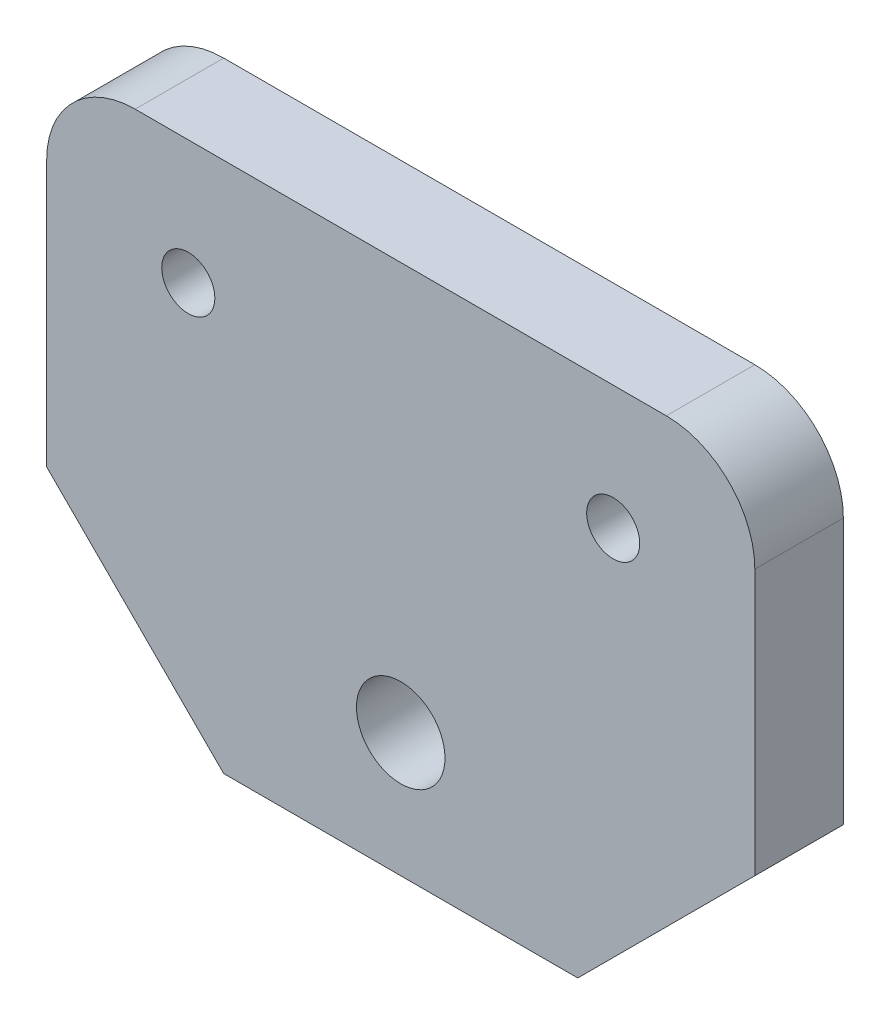
ISO-10303-21;
HEADER;
FILE_DESCRIPTION(('STEP AP214'),'2;1');
FILE_NAME('part.step','',(''),(''),'','','');
FILE_SCHEMA(('AUTOMOTIVE_DESIGN { 1 0 10303 214 1 1 1 1 }'));
ENDSEC;
DATA;
#1=APPLICATION_CONTEXT('core data for automotive mechanical design processes');
#2=APPLICATION_PROTOCOL_DEFINITION('international standard','automotive_design',2000,#1);
#3=PRODUCT_CONTEXT('',#1,'mechanical');
#4=PRODUCT('Part','Part','',(#3));
#5=PRODUCT_RELATED_PRODUCT_CATEGORY('part','',(#4));
#6=PRODUCT_DEFINITION_FORMATION('','',#4);
#7=PRODUCT_DEFINITION_CONTEXT('part definition',#1,'design');
#8=PRODUCT_DEFINITION('design','',#6,#7);
#9=PRODUCT_DEFINITION_SHAPE('','',#8);
#10=(LENGTH_UNIT() NAMED_UNIT(*) SI_UNIT(.MILLI.,.METRE.));
#11=(NAMED_UNIT(*) PLANE_ANGLE_UNIT() SI_UNIT($,.RADIAN.));
#12=(NAMED_UNIT(*) SI_UNIT($,.STERADIAN.) SOLID_ANGLE_UNIT());
#13=UNCERTAINTY_MEASURE_WITH_UNIT(LENGTH_MEASURE(1.E-05),#10,'distance_accuracy_value','');
#14=(GEOMETRIC_REPRESENTATION_CONTEXT(3) GLOBAL_UNCERTAINTY_ASSIGNED_CONTEXT((#13)) GLOBAL_UNIT_ASSIGNED_CONTEXT((#10,
#11,#12)) REPRESENTATION_CONTEXT('',''));
#15=CARTESIAN_POINT('',(0.,0.,0.));
#16=DIRECTION('',(0.,0.,1.));
#17=DIRECTION('',(1.,0.,0.));
#18=AXIS2_PLACEMENT_3D('',#15,#16,#17);
#19=CARTESIAN_POINT('',(0.,0.,5.));
#20=DIRECTION('',(1.,0.,0.));
#21=DIRECTION('',(0.,0.,-1.));
#22=AXIS2_PLACEMENT_3D('',#19,#20,#21);
#23=PLANE('',#22);
#24=DIRECTION('',(0.,-1.,0.));
#25=VECTOR('',#24,1.);
#26=CARTESIAN_POINT('',(0.,0.,5.));
#27=LINE('',#26,#25);
#28=CARTESIAN_POINT('',(0.,25.,5.));
#29=VERTEX_POINT('',#28);
#30=CARTESIAN_POINT('',(0.,10.,5.));
#31=VERTEX_POINT('',#30);
#32=EDGE_CURVE('E129',#29,#31,#27,.T.);
#33=ORIENTED_EDGE('',*,*,#32,.F.);
#34=DIRECTION('',(0.,0.,-1.));
#35=VECTOR('',#34,1.);
#36=CARTESIAN_POINT('',(0.,25.,5.));
#37=LINE('',#36,#35);
#38=CARTESIAN_POINT('',(0.,25.,0.));
#39=VERTEX_POINT('',#38);
#40=EDGE_CURVE('E11',#29,#39,#37,.T.);
#41=ORIENTED_EDGE('',*,*,#40,.T.);
#42=DIRECTION('',(0.,-1.,0.));
#43=VECTOR('',#42,1.);
#44=CARTESIAN_POINT('',(0.,0.,0.));
#45=LINE('',#44,#43);
#46=CARTESIAN_POINT('',(0.,10.,0.));
#47=VERTEX_POINT('',#46);
#48=EDGE_CURVE('E131',#39,#47,#45,.T.);
#49=ORIENTED_EDGE('',*,*,#48,.T.);
#50=DIRECTION('',(0.,0.,1.));
#51=VECTOR('',#50,1.);
#52=CARTESIAN_POINT('',(0.,10.,5.));
#53=LINE('',#52,#51);
#54=EDGE_CURVE('E144',#47,#31,#53,.T.);
#55=ORIENTED_EDGE('',*,*,#54,.T.);
#56=EDGE_LOOP('',(#33,#41,#49,#55));
#57=FACE_BOUND('',#56,.T.);
#58=ADVANCED_FACE('F36',(#57),#23,.F.);
#59=CARTESIAN_POINT('',(0.,0.,5.));
#60=DIRECTION('',(0.,1.,0.));
#61=DIRECTION('',(0.,0.,1.));
#62=AXIS2_PLACEMENT_3D('',#59,#60,#61);
#63=PLANE('',#62);
#64=DIRECTION('',(1.,0.,0.));
#65=VECTOR('',#64,1.);
#66=CARTESIAN_POINT('',(0.,0.,0.));
#67=LINE('',#66,#65);
#68=CARTESIAN_POINT('',(10.,0.,0.));
#69=VERTEX_POINT('',#68);
#70=CARTESIAN_POINT('',(30.,0.,0.));
#71=VERTEX_POINT('',#70);
#72=EDGE_CURVE('E126',#69,#71,#67,.T.);
#73=ORIENTED_EDGE('',*,*,#72,.T.);
#74=DIRECTION('',(0.,0.,1.));
#75=VECTOR('',#74,1.);
#76=CARTESIAN_POINT('',(30.,0.,5.));
#77=LINE('',#76,#75);
#78=CARTESIAN_POINT('',(30.,0.,5.));
#79=VERTEX_POINT('',#78);
#80=EDGE_CURVE('E109',#71,#79,#77,.T.);
#81=ORIENTED_EDGE('',*,*,#80,.T.);
#82=DIRECTION('',(1.,0.,0.));
#83=VECTOR('',#82,1.);
#84=CARTESIAN_POINT('',(0.,0.,5.));
#85=LINE('',#84,#83);
#86=CARTESIAN_POINT('',(10.,0.,5.));
#87=VERTEX_POINT('',#86);
#88=EDGE_CURVE('E314',#87,#79,#85,.T.);
#89=ORIENTED_EDGE('',*,*,#88,.F.);
#90=DIRECTION('',(0.,0.,-1.));
#91=VECTOR('',#90,1.);
#92=CARTESIAN_POINT('',(10.,0.,5.));
#93=LINE('',#92,#91);
#94=EDGE_CURVE('E114',#87,#69,#93,.T.);
#95=ORIENTED_EDGE('',*,*,#94,.T.);
#96=EDGE_LOOP('',(#73,#81,#89,#95));
#97=FACE_BOUND('',#96,.T.);
#98=ADVANCED_FACE('F176',(#97),#63,.F.);
#99=CARTESIAN_POINT('',(40.,0.,5.));
#100=DIRECTION('',(-1.,0.,0.));
#101=DIRECTION('',(0.,0.,1.));
#102=AXIS2_PLACEMENT_3D('',#99,#100,#101);
#103=PLANE('',#102);
#104=DIRECTION('',(0.,1.,0.));
#105=VECTOR('',#104,1.);
#106=CARTESIAN_POINT('',(40.,0.,0.));
#107=LINE('',#106,#105);
#108=CARTESIAN_POINT('',(40.,10.,0.));
#109=VERTEX_POINT('',#108);
#110=CARTESIAN_POINT('',(40.,25.,0.));
#111=VERTEX_POINT('',#110);
#112=EDGE_CURVE('E118',#109,#111,#107,.T.);
#113=ORIENTED_EDGE('',*,*,#112,.T.);
#114=DIRECTION('',(0.,0.,-1.));
#115=VECTOR('',#114,1.);
#116=CARTESIAN_POINT('',(40.,25.,5.));
#117=LINE('',#116,#115);
#118=CARTESIAN_POINT('',(40.,25.,5.));
#119=VERTEX_POINT('',#118);
#120=EDGE_CURVE('E59',#111,#119,#117,.F.);
#121=ORIENTED_EDGE('',*,*,#120,.T.);
#122=DIRECTION('',(0.,1.,0.));
#123=VECTOR('',#122,1.);
#124=CARTESIAN_POINT('',(40.,0.,5.));
#125=LINE('',#124,#123);
#126=CARTESIAN_POINT('',(40.,10.,5.));
#127=VERTEX_POINT('',#126);
#128=EDGE_CURVE('E119',#127,#119,#125,.T.);
#129=ORIENTED_EDGE('',*,*,#128,.F.);
#130=DIRECTION('',(0.,0.,-1.));
#131=VECTOR('',#130,1.);
#132=CARTESIAN_POINT('',(40.,10.,5.));
#133=LINE('',#132,#131);
#134=EDGE_CURVE('E108',#127,#109,#133,.T.);
#135=ORIENTED_EDGE('',*,*,#134,.T.);
#136=EDGE_LOOP('',(#113,#121,#129,#135));
#137=FACE_BOUND('',#136,.T.);
#138=ADVANCED_FACE('F117',(#137),#103,.F.);
#139=CARTESIAN_POINT('',(0.,30.,5.));
#140=DIRECTION('',(0.,-1.,0.));
#141=DIRECTION('',(0.,0.,-1.));
#142=AXIS2_PLACEMENT_3D('',#139,#140,#141);
#143=PLANE('',#142);
#144=DIRECTION('',(-1.,0.,0.));
#145=VECTOR('',#144,1.);
#146=CARTESIAN_POINT('',(0.,30.,5.));
#147=LINE('',#146,#145);
#148=CARTESIAN_POINT('',(35.,30.,5.));
#149=VERTEX_POINT('',#148);
#150=CARTESIAN_POINT('',(5.,30.,5.));
#151=VERTEX_POINT('',#150);
#152=EDGE_CURVE('E120',#149,#151,#147,.T.);
#153=ORIENTED_EDGE('',*,*,#152,.F.);
#154=DIRECTION('',(0.,0.,-1.));
#155=VECTOR('',#154,1.);
#156=CARTESIAN_POINT('',(35.,30.,5.));
#157=LINE('',#156,#155);
#158=CARTESIAN_POINT('',(35.,30.,0.));
#159=VERTEX_POINT('',#158);
#160=EDGE_CURVE('E149',#149,#159,#157,.T.);
#161=ORIENTED_EDGE('',*,*,#160,.T.);
#162=DIRECTION('',(-1.,0.,0.));
#163=VECTOR('',#162,1.);
#164=CARTESIAN_POINT('',(0.,30.,0.));
#165=LINE('',#164,#163);
#166=CARTESIAN_POINT('',(5.,30.,0.));
#167=VERTEX_POINT('',#166);
#168=EDGE_CURVE('E125',#159,#167,#165,.T.);
#169=ORIENTED_EDGE('',*,*,#168,.T.);
#170=DIRECTION('',(0.,0.,-1.));
#171=VECTOR('',#170,1.);
#172=CARTESIAN_POINT('',(5.,30.,5.));
#173=LINE('',#172,#171);
#174=EDGE_CURVE('E147',#167,#151,#173,.F.);
#175=ORIENTED_EDGE('',*,*,#174,.T.);
#176=EDGE_LOOP('',(#153,#161,#169,#175));
#177=FACE_BOUND('',#176,.T.);
#178=ADVANCED_FACE('F162',(#177),#143,.F.);
#179=CARTESIAN_POINT('',(0.,0.,5.));
#180=DIRECTION('',(0.,0.,-1.));
#181=DIRECTION('',(-1.,0.,0.));
#182=AXIS2_PLACEMENT_3D('',#179,#180,#181);
#183=PLANE('',#182);
#184=CARTESIAN_POINT('',(8.,23.,5.));
#185=DIRECTION('',(0.,0.,-1.));
#186=DIRECTION('',(-1.,0.,0.));
#187=AXIS2_PLACEMENT_3D('',#184,#185,#186);
#188=CIRCLE('',#187,1.5);
#189=CARTESIAN_POINT('',(6.5,23.,5.));
#190=VERTEX_POINT('',#189);
#191=EDGE_CURVE('E310',#190,#190,#188,.T.);
#192=ORIENTED_EDGE('',*,*,#191,.T.);
#193=EDGE_LOOP('',(#192));
#194=FACE_BOUND('',#193,.T.);
#195=CARTESIAN_POINT('',(32.,23.,5.));
#196=DIRECTION('',(0.,0.,-1.));
#197=DIRECTION('',(-1.,0.,0.));
#198=AXIS2_PLACEMENT_3D('',#195,#196,#197);
#199=CIRCLE('',#198,1.5);
#200=CARTESIAN_POINT('',(30.5,23.,5.));
#201=VERTEX_POINT('',#200);
#202=EDGE_CURVE('E307',#201,#201,#199,.T.);
#203=ORIENTED_EDGE('',*,*,#202,.T.);
#204=EDGE_LOOP('',(#203));
#205=FACE_BOUND('',#204,.T.);
#206=CARTESIAN_POINT('',(20.,7.,5.));
#207=DIRECTION('',(0.,0.,-1.));
#208=DIRECTION('',(-1.,0.,0.));
#209=AXIS2_PLACEMENT_3D('',#206,#207,#208);
#210=CIRCLE('',#209,2.5);
#211=CARTESIAN_POINT('',(17.5,7.,5.));
#212=VERTEX_POINT('',#211);
#213=EDGE_CURVE('E304',#212,#212,#210,.T.);
#214=ORIENTED_EDGE('',*,*,#213,.T.);
#215=EDGE_LOOP('',(#214));
#216=FACE_BOUND('',#215,.T.);
#217=ORIENTED_EDGE('',*,*,#128,.T.);
#218=CARTESIAN_POINT('',(35.,25.,5.));
#219=DIRECTION('',(0.,0.,-1.));
#220=DIRECTION('',(-1.,0.,0.));
#221=AXIS2_PLACEMENT_3D('',#218,#219,#220);
#222=CIRCLE('',#221,5.);
#223=EDGE_CURVE('E44',#119,#149,#222,.F.);
#224=ORIENTED_EDGE('',*,*,#223,.T.);
#225=ORIENTED_EDGE('',*,*,#152,.T.);
#226=CARTESIAN_POINT('',(5.,25.,5.));
#227=DIRECTION('',(0.,0.,-1.));
#228=DIRECTION('',(-1.,0.,0.));
#229=AXIS2_PLACEMENT_3D('',#226,#227,#228);
#230=CIRCLE('',#229,5.);
#231=EDGE_CURVE('E51',#151,#29,#230,.F.);
#232=ORIENTED_EDGE('',*,*,#231,.T.);
#233=ORIENTED_EDGE('',*,*,#32,.T.);
#234=DIRECTION('',(-0.707106781186546,0.707106781186549,0.));
#235=VECTOR('',#234,1.);
#236=CARTESIAN_POINT('',(10.,0.,5.));
#237=LINE('',#236,#235);
#238=EDGE_CURVE('E140',#31,#87,#237,.F.);
#239=ORIENTED_EDGE('',*,*,#238,.T.);
#240=ORIENTED_EDGE('',*,*,#88,.T.);
#241=DIRECTION('',(-0.707106781186549,-0.707106781186546,0.));
#242=VECTOR('',#241,1.);
#243=CARTESIAN_POINT('',(40.,10.,5.));
#244=LINE('',#243,#242);
#245=EDGE_CURVE('E142',#79,#127,#244,.F.);
#246=ORIENTED_EDGE('',*,*,#245,.T.);
#247=EDGE_LOOP('',(#217,#224,#225,#232,#233,#239,#240,#246));
#248=FACE_BOUND('',#247,.T.);
#249=ADVANCED_FACE('F158',(#194,#205,#216,#248),#183,.F.);
#250=CARTESIAN_POINT('',(0.,0.,0.));
#251=DIRECTION('',(0.,0.,-1.));
#252=DIRECTION('',(-1.,0.,0.));
#253=AXIS2_PLACEMENT_3D('',#250,#251,#252);
#254=PLANE('',#253);
#255=CARTESIAN_POINT('',(8.,23.,0.));
#256=DIRECTION('',(0.,0.,1.));
#257=DIRECTION('',(1.,0.,0.));
#258=AXIS2_PLACEMENT_3D('',#255,#256,#257);
#259=CIRCLE('',#258,1.5);
#260=CARTESIAN_POINT('',(9.5,23.,0.));
#261=VERTEX_POINT('',#260);
#262=EDGE_CURVE('E292',#261,#261,#259,.T.);
#263=ORIENTED_EDGE('',*,*,#262,.T.);
#264=EDGE_LOOP('',(#263));
#265=FACE_BOUND('',#264,.T.);
#266=CARTESIAN_POINT('',(32.,23.,0.));
#267=DIRECTION('',(0.,0.,1.));
#268=DIRECTION('',(-1.,0.,0.));
#269=AXIS2_PLACEMENT_3D('',#266,#267,#268);
#270=CIRCLE('',#269,1.5);
#271=CARTESIAN_POINT('',(30.5,23.,0.));
#272=VERTEX_POINT('',#271);
#273=EDGE_CURVE('E296',#272,#272,#270,.T.);
#274=ORIENTED_EDGE('',*,*,#273,.T.);
#275=EDGE_LOOP('',(#274));
#276=FACE_BOUND('',#275,.T.);
#277=CARTESIAN_POINT('',(20.,7.,0.));
#278=DIRECTION('',(0.,0.,1.));
#279=DIRECTION('',(1.,0.,0.));
#280=AXIS2_PLACEMENT_3D('',#277,#278,#279);
#281=CIRCLE('',#280,2.5);
#282=CARTESIAN_POINT('',(22.5,7.,0.));
#283=VERTEX_POINT('',#282);
#284=EDGE_CURVE('E299',#283,#283,#281,.T.);
#285=ORIENTED_EDGE('',*,*,#284,.T.);
#286=EDGE_LOOP('',(#285));
#287=FACE_BOUND('',#286,.T.);
#288=ORIENTED_EDGE('',*,*,#168,.F.);
#289=CARTESIAN_POINT('',(35.,25.,0.));
#290=DIRECTION('',(0.,0.,-1.));
#291=DIRECTION('',(-1.,0.,0.));
#292=AXIS2_PLACEMENT_3D('',#289,#290,#291);
#293=CIRCLE('',#292,5.);
#294=EDGE_CURVE('E124',#159,#111,#293,.T.);
#295=ORIENTED_EDGE('',*,*,#294,.T.);
#296=ORIENTED_EDGE('',*,*,#112,.F.);
#297=DIRECTION('',(0.707106781186549,0.707106781186546,0.));
#298=VECTOR('',#297,1.);
#299=CARTESIAN_POINT('',(14.9999999999999,-15.,0.));
#300=LINE('',#299,#298);
#301=EDGE_CURVE('E104',#109,#71,#300,.F.);
#302=ORIENTED_EDGE('',*,*,#301,.T.);
#303=ORIENTED_EDGE('',*,*,#72,.F.);
#304=DIRECTION('',(0.707106781186546,-0.707106781186549,0.));
#305=VECTOR('',#304,1.);
#306=CARTESIAN_POINT('',(5.00000000000002,5.,0.));
#307=LINE('',#306,#305);
#308=EDGE_CURVE('E115',#69,#47,#307,.F.);
#309=ORIENTED_EDGE('',*,*,#308,.T.);
#310=ORIENTED_EDGE('',*,*,#48,.F.);
#311=CARTESIAN_POINT('',(5.,25.,0.));
#312=DIRECTION('',(0.,0.,-1.));
#313=DIRECTION('',(-1.,0.,0.));
#314=AXIS2_PLACEMENT_3D('',#311,#312,#313);
#315=CIRCLE('',#314,5.);
#316=EDGE_CURVE('E152',#39,#167,#315,.T.);
#317=ORIENTED_EDGE('',*,*,#316,.T.);
#318=EDGE_LOOP('',(#288,#295,#296,#302,#303,#309,#310,#317));
#319=FACE_BOUND('',#318,.T.);
#320=ADVANCED_FACE('F123',(#265,#276,#287,#319),#254,.T.);
#321=CARTESIAN_POINT('',(20.,7.,0.));
#322=DIRECTION('',(0.,0.,1.));
#323=DIRECTION('',(1.,0.,0.));
#324=AXIS2_PLACEMENT_3D('',#321,#322,#323);
#325=CYLINDRICAL_SURFACE('',#324,2.5);
#326=ORIENTED_EDGE('',*,*,#284,.F.);
#327=EDGE_LOOP('',(#326));
#328=FACE_BOUND('',#327,.T.);
#329=ORIENTED_EDGE('',*,*,#213,.F.);
#330=EDGE_LOOP('',(#329));
#331=FACE_BOUND('',#330,.T.);
#332=ADVANCED_FACE('F203',(#328,#331),#325,.F.);
#333=CARTESIAN_POINT('',(32.,23.,0.));
#334=DIRECTION('',(0.,0.,1.));
#335=DIRECTION('',(1.,0.,0.));
#336=AXIS2_PLACEMENT_3D('',#333,#334,#335);
#337=CYLINDRICAL_SURFACE('',#336,1.5);
#338=ORIENTED_EDGE('',*,*,#273,.F.);
#339=EDGE_LOOP('',(#338));
#340=FACE_BOUND('',#339,.T.);
#341=ORIENTED_EDGE('',*,*,#202,.F.);
#342=EDGE_LOOP('',(#341));
#343=FACE_BOUND('',#342,.T.);
#344=ADVANCED_FACE('F197',(#340,#343),#337,.F.);
#345=CARTESIAN_POINT('',(8.,23.,0.));
#346=DIRECTION('',(0.,0.,1.));
#347=DIRECTION('',(1.,0.,0.));
#348=AXIS2_PLACEMENT_3D('',#345,#346,#347);
#349=CYLINDRICAL_SURFACE('',#348,1.5);
#350=ORIENTED_EDGE('',*,*,#262,.F.);
#351=EDGE_LOOP('',(#350));
#352=FACE_BOUND('',#351,.T.);
#353=ORIENTED_EDGE('',*,*,#191,.F.);
#354=EDGE_LOOP('',(#353));
#355=FACE_BOUND('',#354,.T.);
#356=ADVANCED_FACE('F191',(#352,#355),#349,.F.);
#357=CARTESIAN_POINT('',(40.,10.,5.));
#358=DIRECTION('',(-0.707106781186546,0.707106781186549,0.));
#359=DIRECTION('',(0.,0.,-1.));
#360=AXIS2_PLACEMENT_3D('',#357,#358,#359);
#361=PLANE('',#360);
#362=ORIENTED_EDGE('',*,*,#245,.F.);
#363=ORIENTED_EDGE('',*,*,#80,.F.);
#364=ORIENTED_EDGE('',*,*,#301,.F.);
#365=ORIENTED_EDGE('',*,*,#134,.F.);
#366=EDGE_LOOP('',(#362,#363,#364,#365));
#367=FACE_BOUND('',#366,.T.);
#368=ADVANCED_FACE('F107',(#367),#361,.F.);
#369=CARTESIAN_POINT('',(10.,0.,5.));
#370=DIRECTION('',(0.707106781186549,0.707106781186546,0.));
#371=DIRECTION('',(0.,0.,-1.));
#372=AXIS2_PLACEMENT_3D('',#369,#370,#371);
#373=PLANE('',#372);
#374=ORIENTED_EDGE('',*,*,#238,.F.);
#375=ORIENTED_EDGE('',*,*,#54,.F.);
#376=ORIENTED_EDGE('',*,*,#308,.F.);
#377=ORIENTED_EDGE('',*,*,#94,.F.);
#378=EDGE_LOOP('',(#374,#375,#376,#377));
#379=FACE_BOUND('',#378,.T.);
#380=ADVANCED_FACE('F167',(#379),#373,.F.);
#381=CARTESIAN_POINT('',(35.,25.,5.));
#382=DIRECTION('',(0.,0.,-1.));
#383=DIRECTION('',(-1.,0.,0.));
#384=AXIS2_PLACEMENT_3D('',#381,#382,#383);
#385=CYLINDRICAL_SURFACE('',#384,5.);
#386=ORIENTED_EDGE('',*,*,#223,.F.);
#387=ORIENTED_EDGE('',*,*,#120,.F.);
#388=ORIENTED_EDGE('',*,*,#294,.F.);
#389=ORIENTED_EDGE('',*,*,#160,.F.);
#390=EDGE_LOOP('',(#386,#387,#388,#389));
#391=FACE_BOUND('',#390,.T.);
#392=ADVANCED_FACE('F165',(#391),#385,.T.);
#393=CARTESIAN_POINT('',(5.,25.,5.));
#394=DIRECTION('',(0.,0.,-1.));
#395=DIRECTION('',(-1.,0.,0.));
#396=AXIS2_PLACEMENT_3D('',#393,#394,#395);
#397=CYLINDRICAL_SURFACE('',#396,5.);
#398=ORIENTED_EDGE('',*,*,#231,.F.);
#399=ORIENTED_EDGE('',*,*,#174,.F.);
#400=ORIENTED_EDGE('',*,*,#316,.F.);
#401=ORIENTED_EDGE('',*,*,#40,.F.);
#402=EDGE_LOOP('',(#398,#399,#400,#401));
#403=FACE_BOUND('',#402,.T.);
#404=ADVANCED_FACE('F38',(#403),#397,.T.);
#405=CLOSED_SHELL('',(#58,#98,#138,#178,#249,#320,#332,#344,#356,#368,#380,#392,#404));
#406=MANIFOLD_SOLID_BREP('B2',#405);
#407=ADVANCED_BREP_SHAPE_REPRESENTATION('',(#18,#406),#14);
#408=SHAPE_DEFINITION_REPRESENTATION(#9,#407);
ENDSEC;
END-ISO-10303-21;
